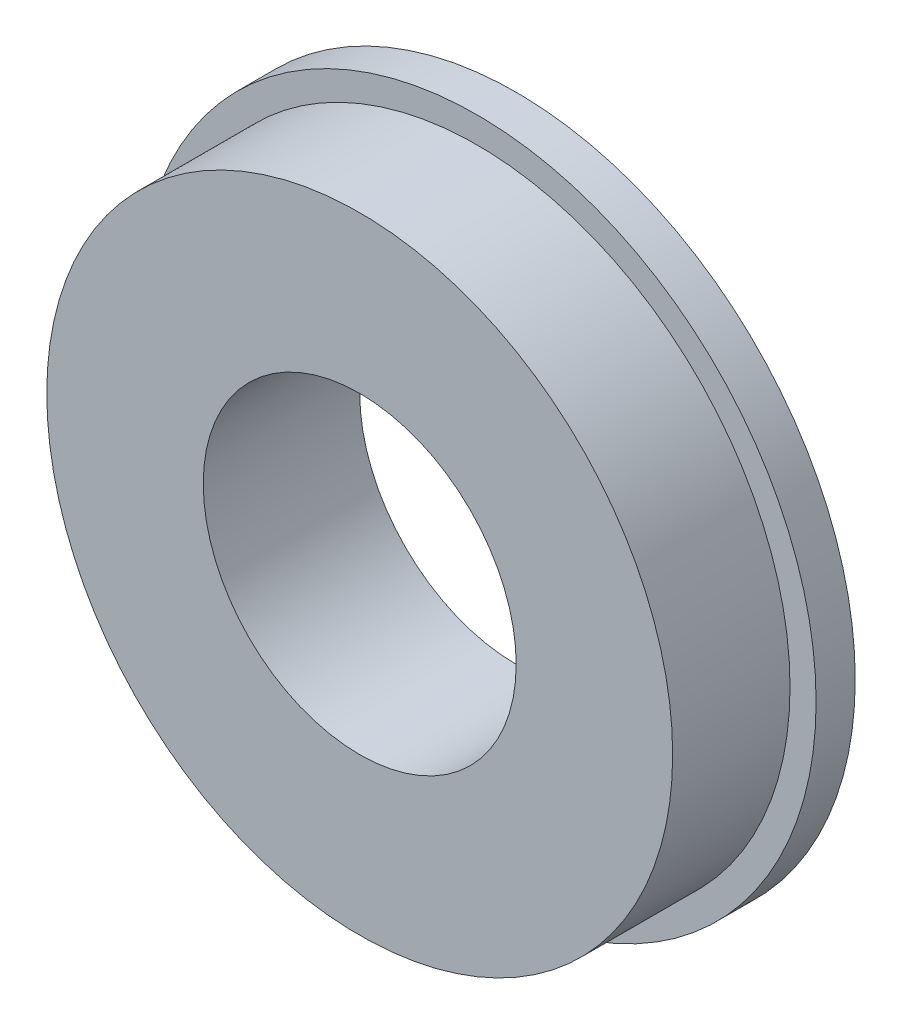
ISO-10303-21;
HEADER;
FILE_DESCRIPTION(('STEP AP214'),'2;1');
FILE_NAME('part.step','',(''),(''),'','','');
FILE_SCHEMA(('AUTOMOTIVE_DESIGN { 1 0 10303 214 1 1 1 1 }'));
ENDSEC;
DATA;
#1=APPLICATION_CONTEXT('core data for automotive mechanical design processes');
#2=APPLICATION_PROTOCOL_DEFINITION('international standard','automotive_design',2000,#1);
#3=PRODUCT_CONTEXT('',#1,'mechanical');
#4=PRODUCT('Part','Part','',(#3));
#5=PRODUCT_RELATED_PRODUCT_CATEGORY('part','',(#4));
#6=PRODUCT_DEFINITION_FORMATION('','',#4);
#7=PRODUCT_DEFINITION_CONTEXT('part definition',#1,'design');
#8=PRODUCT_DEFINITION('design','',#6,#7);
#9=PRODUCT_DEFINITION_SHAPE('','',#8);
#10=(LENGTH_UNIT() NAMED_UNIT(*) SI_UNIT(.MILLI.,.METRE.));
#11=(NAMED_UNIT(*) PLANE_ANGLE_UNIT() SI_UNIT($,.RADIAN.));
#12=(NAMED_UNIT(*) SI_UNIT($,.STERADIAN.) SOLID_ANGLE_UNIT());
#13=UNCERTAINTY_MEASURE_WITH_UNIT(LENGTH_MEASURE(1.E-05),#10,'distance_accuracy_value','');
#14=(GEOMETRIC_REPRESENTATION_CONTEXT(3) GLOBAL_UNCERTAINTY_ASSIGNED_CONTEXT((#13)) GLOBAL_UNIT_ASSIGNED_CONTEXT((#10,
#11,#12)) REPRESENTATION_CONTEXT('',''));
#15=CARTESIAN_POINT('',(0.,0.,0.));
#16=DIRECTION('',(0.,0.,1.));
#17=DIRECTION('',(1.,0.,0.));
#18=AXIS2_PLACEMENT_3D('',#15,#16,#17);
#19=CARTESIAN_POINT('',(0.,0.,1.5));
#20=DIRECTION('',(0.,0.,-1.));
#21=DIRECTION('',(-1.,0.,0.));
#22=AXIS2_PLACEMENT_3D('',#19,#20,#21);
#23=CYLINDRICAL_SURFACE('',#22,13.);
#24=CARTESIAN_POINT('',(0.,0.,1.5));
#25=DIRECTION('',(0.,0.,1.));
#26=DIRECTION('',(1.,0.,0.));
#27=AXIS2_PLACEMENT_3D('',#24,#25,#26);
#28=CIRCLE('',#27,13.);
#29=CARTESIAN_POINT('',(13.,0.,1.5));
#30=VERTEX_POINT('',#29);
#31=EDGE_CURVE('E49',#30,#30,#28,.T.);
#32=ORIENTED_EDGE('',*,*,#31,.F.);
#33=EDGE_LOOP('',(#32));
#34=FACE_BOUND('',#33,.T.);
#35=CARTESIAN_POINT('',(0.,0.,0.));
#36=DIRECTION('',(0.,0.,1.));
#37=DIRECTION('',(1.,0.,0.));
#38=AXIS2_PLACEMENT_3D('',#35,#36,#37);
#39=CIRCLE('',#38,13.);
#40=CARTESIAN_POINT('',(13.,0.,0.));
#41=VERTEX_POINT('',#40);
#42=EDGE_CURVE('E44',#41,#41,#39,.T.);
#43=ORIENTED_EDGE('',*,*,#42,.T.);
#44=EDGE_LOOP('',(#43));
#45=FACE_BOUND('',#44,.T.);
#46=ADVANCED_FACE('F41',(#34,#45),#23,.T.);
#47=CARTESIAN_POINT('',(0.,0.,1.5));
#48=DIRECTION('',(0.,0.,1.));
#49=DIRECTION('',(1.,0.,0.));
#50=AXIS2_PLACEMENT_3D('',#47,#48,#49);
#51=PLANE('',#50);
#52=CARTESIAN_POINT('',(0.,0.,1.5));
#53=DIRECTION('',(0.,0.,1.));
#54=DIRECTION('',(1.,0.,0.));
#55=AXIS2_PLACEMENT_3D('',#52,#53,#54);
#56=CIRCLE('',#55,12.);
#57=CARTESIAN_POINT('',(12.,0.,1.5));
#58=VERTEX_POINT('',#57);
#59=EDGE_CURVE('E10',#58,#58,#56,.T.);
#60=ORIENTED_EDGE('',*,*,#59,.F.);
#61=EDGE_LOOP('',(#60));
#62=FACE_BOUND('',#61,.T.);
#63=ORIENTED_EDGE('',*,*,#31,.T.);
#64=EDGE_LOOP('',(#63));
#65=FACE_BOUND('',#64,.T.);
#66=ADVANCED_FACE('F90',(#62,#65),#51,.T.);
#67=CARTESIAN_POINT('',(0.,0.,0.));
#68=DIRECTION('',(0.,0.,1.));
#69=DIRECTION('',(1.,0.,0.));
#70=AXIS2_PLACEMENT_3D('',#67,#68,#69);
#71=PLANE('',#70);
#72=CARTESIAN_POINT('',(0.,0.,0.));
#73=DIRECTION('',(0.,0.,1.));
#74=DIRECTION('',(1.,0.,0.));
#75=AXIS2_PLACEMENT_3D('',#72,#73,#74);
#76=CIRCLE('',#75,6.);
#77=CARTESIAN_POINT('',(6.,0.,0.));
#78=VERTEX_POINT('',#77);
#79=EDGE_CURVE('E60',#78,#78,#76,.T.);
#80=ORIENTED_EDGE('',*,*,#79,.T.);
#81=EDGE_LOOP('',(#80));
#82=FACE_BOUND('',#81,.T.);
#83=ORIENTED_EDGE('',*,*,#42,.F.);
#84=EDGE_LOOP('',(#83));
#85=FACE_BOUND('',#84,.T.);
#86=ADVANCED_FACE('F69',(#82,#85),#71,.F.);
#87=CARTESIAN_POINT('',(0.,0.,6.));
#88=DIRECTION('',(0.,0.,-1.));
#89=DIRECTION('',(-1.,0.,0.));
#90=AXIS2_PLACEMENT_3D('',#87,#88,#89);
#91=CYLINDRICAL_SURFACE('',#90,12.);
#92=CARTESIAN_POINT('',(0.,0.,6.));
#93=DIRECTION('',(0.,0.,1.));
#94=DIRECTION('',(1.,0.,0.));
#95=AXIS2_PLACEMENT_3D('',#92,#93,#94);
#96=CIRCLE('',#95,12.);
#97=CARTESIAN_POINT('',(12.,0.,6.));
#98=VERTEX_POINT('',#97);
#99=EDGE_CURVE('E56',#98,#98,#96,.T.);
#100=ORIENTED_EDGE('',*,*,#99,.F.);
#101=EDGE_LOOP('',(#100));
#102=FACE_BOUND('',#101,.T.);
#103=ORIENTED_EDGE('',*,*,#59,.T.);
#104=EDGE_LOOP('',(#103));
#105=FACE_BOUND('',#104,.T.);
#106=ADVANCED_FACE('F81',(#102,#105),#91,.T.);
#107=CARTESIAN_POINT('',(0.,0.,6.));
#108=DIRECTION('',(0.,0.,1.));
#109=DIRECTION('',(1.,0.,0.));
#110=AXIS2_PLACEMENT_3D('',#107,#108,#109);
#111=PLANE('',#110);
#112=CARTESIAN_POINT('',(0.,0.,6.));
#113=DIRECTION('',(0.,0.,1.));
#114=DIRECTION('',(1.,0.,0.));
#115=AXIS2_PLACEMENT_3D('',#112,#113,#114);
#116=CIRCLE('',#115,6.);
#117=CARTESIAN_POINT('',(6.,0.,6.));
#118=VERTEX_POINT('',#117);
#119=EDGE_CURVE('E61',#118,#118,#116,.T.);
#120=ORIENTED_EDGE('',*,*,#119,.F.);
#121=EDGE_LOOP('',(#120));
#122=FACE_BOUND('',#121,.T.);
#123=ORIENTED_EDGE('',*,*,#99,.T.);
#124=EDGE_LOOP('',(#123));
#125=FACE_BOUND('',#124,.T.);
#126=ADVANCED_FACE('F75',(#122,#125),#111,.T.);
#127=CARTESIAN_POINT('',(0.,0.,0.));
#128=DIRECTION('',(0.,0.,1.));
#129=DIRECTION('',(1.,0.,0.));
#130=AXIS2_PLACEMENT_3D('',#127,#128,#129);
#131=CYLINDRICAL_SURFACE('',#130,6.);
#132=ORIENTED_EDGE('',*,*,#79,.F.);
#133=EDGE_LOOP('',(#132));
#134=FACE_BOUND('',#133,.T.);
#135=ORIENTED_EDGE('',*,*,#119,.T.);
#136=EDGE_LOOP('',(#135));
#137=FACE_BOUND('',#136,.T.);
#138=ADVANCED_FACE('F72',(#134,#137),#131,.F.);
#139=CLOSED_SHELL('',(#46,#66,#86,#106,#126,#138));
#140=MANIFOLD_SOLID_BREP('B2',#139);
#141=ADVANCED_BREP_SHAPE_REPRESENTATION('',(#18,#140),#14);
#142=SHAPE_DEFINITION_REPRESENTATION(#9,#141);
ENDSEC;
END-ISO-10303-21;
